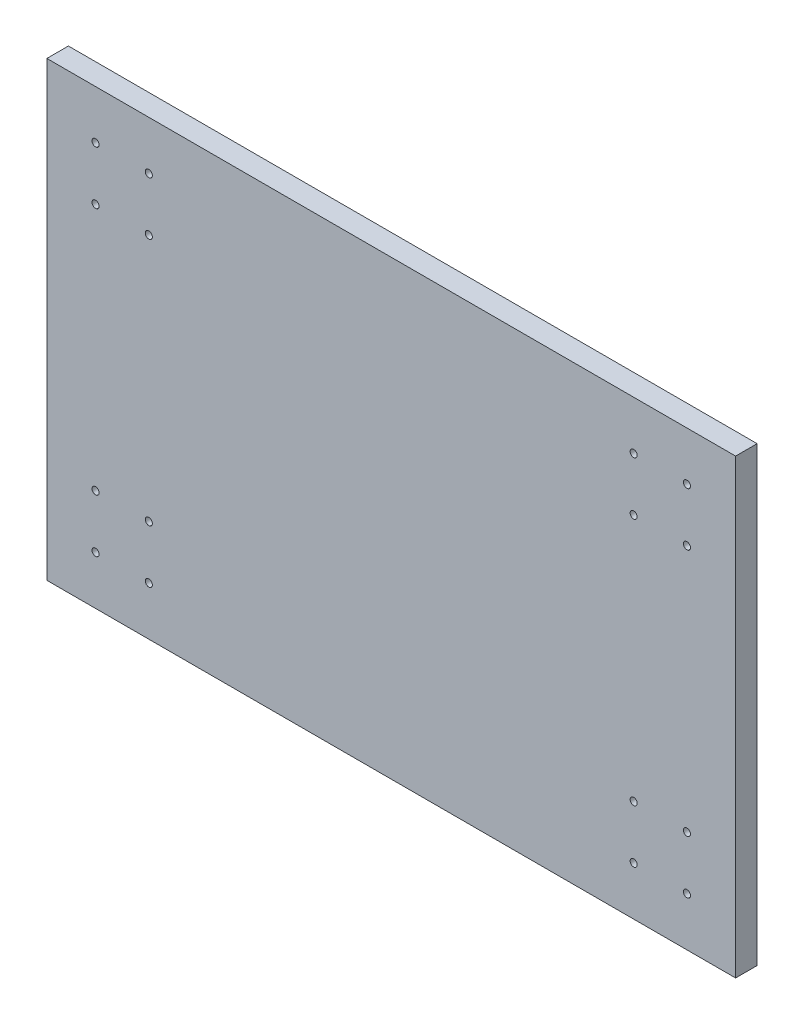
ISO-10303-21;
HEADER;
FILE_DESCRIPTION(('STEP AP214'),'2;1');
FILE_NAME('part.step','',(''),(''),'','','');
FILE_SCHEMA(('AUTOMOTIVE_DESIGN { 1 0 10303 214 1 1 1 1 }'));
ENDSEC;
DATA;
#1=APPLICATION_CONTEXT('core data for automotive mechanical design processes');
#2=APPLICATION_PROTOCOL_DEFINITION('international standard','automotive_design',2000,#1);
#3=PRODUCT_CONTEXT('',#1,'mechanical');
#4=PRODUCT('Part','Part','',(#3));
#5=PRODUCT_RELATED_PRODUCT_CATEGORY('part','',(#4));
#6=PRODUCT_DEFINITION_FORMATION('','',#4);
#7=PRODUCT_DEFINITION_CONTEXT('part definition',#1,'design');
#8=PRODUCT_DEFINITION('design','',#6,#7);
#9=PRODUCT_DEFINITION_SHAPE('','',#8);
#10=(LENGTH_UNIT() NAMED_UNIT(*) SI_UNIT(.MILLI.,.METRE.));
#11=(NAMED_UNIT(*) PLANE_ANGLE_UNIT() SI_UNIT($,.RADIAN.));
#12=(NAMED_UNIT(*) SI_UNIT($,.STERADIAN.) SOLID_ANGLE_UNIT());
#13=UNCERTAINTY_MEASURE_WITH_UNIT(LENGTH_MEASURE(1.E-05),#10,'distance_accuracy_value','');
#14=(GEOMETRIC_REPRESENTATION_CONTEXT(3) GLOBAL_UNCERTAINTY_ASSIGNED_CONTEXT((#13)) GLOBAL_UNIT_ASSIGNED_CONTEXT((#10,
#11,#12)) REPRESENTATION_CONTEXT('',''));
#15=CARTESIAN_POINT('',(0.,0.,0.));
#16=DIRECTION('',(0.,0.,1.));
#17=DIRECTION('',(1.,0.,0.));
#18=AXIS2_PLACEMENT_3D('',#15,#16,#17);
#19=CARTESIAN_POINT('',(0.,0.,10.));
#20=DIRECTION('',(1.,0.,0.));
#21=DIRECTION('',(0.,0.,-1.));
#22=AXIS2_PLACEMENT_3D('',#19,#20,#21);
#23=PLANE('',#22);
#24=DIRECTION('',(0.,-1.,0.));
#25=VECTOR('',#24,1.);
#26=CARTESIAN_POINT('',(0.,0.,0.));
#27=LINE('',#26,#25);
#28=CARTESIAN_POINT('',(0.,210.,0.));
#29=VERTEX_POINT('',#28);
#30=CARTESIAN_POINT('',(0.,0.,0.));
#31=VERTEX_POINT('',#30);
#32=EDGE_CURVE('E106',#29,#31,#27,.T.);
#33=ORIENTED_EDGE('',*,*,#32,.T.);
#34=DIRECTION('',(0.,0.,-1.));
#35=VECTOR('',#34,1.);
#36=CARTESIAN_POINT('',(0.,0.,10.));
#37=LINE('',#36,#35);
#38=CARTESIAN_POINT('',(0.,0.,10.));
#39=VERTEX_POINT('',#38);
#40=EDGE_CURVE('E11',#39,#31,#37,.T.);
#41=ORIENTED_EDGE('',*,*,#40,.F.);
#42=DIRECTION('',(0.,-1.,0.));
#43=VECTOR('',#42,1.);
#44=CARTESIAN_POINT('',(0.,0.,10.));
#45=LINE('',#44,#43);
#46=CARTESIAN_POINT('',(0.,210.,10.));
#47=VERTEX_POINT('',#46);
#48=EDGE_CURVE('E93',#47,#39,#45,.T.);
#49=ORIENTED_EDGE('',*,*,#48,.F.);
#50=DIRECTION('',(0.,0.,-1.));
#51=VECTOR('',#50,1.);
#52=CARTESIAN_POINT('',(0.,210.,10.));
#53=LINE('',#52,#51);
#54=EDGE_CURVE('E102',#47,#29,#53,.T.);
#55=ORIENTED_EDGE('',*,*,#54,.T.);
#56=EDGE_LOOP('',(#33,#41,#49,#55));
#57=FACE_BOUND('',#56,.T.);
#58=ADVANCED_FACE('F40',(#57),#23,.F.);
#59=CARTESIAN_POINT('',(0.,0.,10.));
#60=DIRECTION('',(0.,1.,0.));
#61=DIRECTION('',(0.,0.,1.));
#62=AXIS2_PLACEMENT_3D('',#59,#60,#61);
#63=PLANE('',#62);
#64=DIRECTION('',(1.,0.,0.));
#65=VECTOR('',#64,1.);
#66=CARTESIAN_POINT('',(0.,0.,0.));
#67=LINE('',#66,#65);
#68=CARTESIAN_POINT('',(320.,0.,0.));
#69=VERTEX_POINT('',#68);
#70=EDGE_CURVE('E97',#31,#69,#67,.T.);
#71=ORIENTED_EDGE('',*,*,#70,.T.);
#72=DIRECTION('',(0.,0.,-1.));
#73=VECTOR('',#72,1.);
#74=CARTESIAN_POINT('',(320.,0.,10.));
#75=LINE('',#74,#73);
#76=CARTESIAN_POINT('',(320.,0.,10.));
#77=VERTEX_POINT('',#76);
#78=EDGE_CURVE('E49',#77,#69,#75,.T.);
#79=ORIENTED_EDGE('',*,*,#78,.F.);
#80=DIRECTION('',(1.,0.,0.));
#81=VECTOR('',#80,1.);
#82=CARTESIAN_POINT('',(0.,0.,10.));
#83=LINE('',#82,#81);
#84=EDGE_CURVE('E88',#39,#77,#83,.T.);
#85=ORIENTED_EDGE('',*,*,#84,.F.);
#86=ORIENTED_EDGE('',*,*,#40,.T.);
#87=EDGE_LOOP('',(#71,#79,#85,#86));
#88=FACE_BOUND('',#87,.T.);
#89=ADVANCED_FACE('F96',(#88),#63,.F.);
#90=CARTESIAN_POINT('',(320.,0.,10.));
#91=DIRECTION('',(-1.,0.,0.));
#92=DIRECTION('',(0.,0.,1.));
#93=AXIS2_PLACEMENT_3D('',#90,#91,#92);
#94=PLANE('',#93);
#95=DIRECTION('',(0.,1.,0.));
#96=VECTOR('',#95,1.);
#97=CARTESIAN_POINT('',(320.,0.,0.));
#98=LINE('',#97,#96);
#99=CARTESIAN_POINT('',(320.,210.,0.));
#100=VERTEX_POINT('',#99);
#101=EDGE_CURVE('E75',#69,#100,#98,.T.);
#102=ORIENTED_EDGE('',*,*,#101,.T.);
#103=DIRECTION('',(0.,0.,-1.));
#104=VECTOR('',#103,1.);
#105=CARTESIAN_POINT('',(320.,210.,10.));
#106=LINE('',#105,#104);
#107=CARTESIAN_POINT('',(320.,210.,10.));
#108=VERTEX_POINT('',#107);
#109=EDGE_CURVE('E98',#108,#100,#106,.T.);
#110=ORIENTED_EDGE('',*,*,#109,.F.);
#111=DIRECTION('',(0.,1.,0.));
#112=VECTOR('',#111,1.);
#113=CARTESIAN_POINT('',(320.,0.,10.));
#114=LINE('',#113,#112);
#115=EDGE_CURVE('E91',#77,#108,#114,.T.);
#116=ORIENTED_EDGE('',*,*,#115,.F.);
#117=ORIENTED_EDGE('',*,*,#78,.T.);
#118=EDGE_LOOP('',(#102,#110,#116,#117));
#119=FACE_BOUND('',#118,.T.);
#120=ADVANCED_FACE('F100',(#119),#94,.F.);
#121=CARTESIAN_POINT('',(0.,210.,10.));
#122=DIRECTION('',(0.,-1.,0.));
#123=DIRECTION('',(0.,0.,-1.));
#124=AXIS2_PLACEMENT_3D('',#121,#122,#123);
#125=PLANE('',#124);
#126=DIRECTION('',(-1.,0.,0.));
#127=VECTOR('',#126,1.);
#128=CARTESIAN_POINT('',(0.,210.,0.));
#129=LINE('',#128,#127);
#130=EDGE_CURVE('E81',#100,#29,#129,.T.);
#131=ORIENTED_EDGE('',*,*,#130,.T.);
#132=ORIENTED_EDGE('',*,*,#54,.F.);
#133=DIRECTION('',(-1.,0.,0.));
#134=VECTOR('',#133,1.);
#135=CARTESIAN_POINT('',(0.,210.,10.));
#136=LINE('',#135,#134);
#137=EDGE_CURVE('E58',#108,#47,#136,.T.);
#138=ORIENTED_EDGE('',*,*,#137,.F.);
#139=ORIENTED_EDGE('',*,*,#109,.T.);
#140=EDGE_LOOP('',(#131,#132,#138,#139));
#141=FACE_BOUND('',#140,.T.);
#142=ADVANCED_FACE('F271',(#141),#125,.F.);
#143=CARTESIAN_POINT('',(0.,210.,10.));
#144=DIRECTION('',(0.,0.,-1.));
#145=DIRECTION('',(-1.,0.,0.));
#146=AXIS2_PLACEMENT_3D('',#143,#144,#145);
#147=PLANE('',#146);
#148=CARTESIAN_POINT('',(22.6256313292354,22.6256313292354,10.));
#149=DIRECTION('',(0.,0.,-1.));
#150=DIRECTION('',(-1.,0.,0.));
#151=AXIS2_PLACEMENT_3D('',#148,#149,#150);
#152=CIRCLE('',#151,1.65);
#153=CARTESIAN_POINT('',(20.9756313292354,22.6256313292354,10.));
#154=VERTEX_POINT('',#153);
#155=EDGE_CURVE('E43',#154,#154,#152,.T.);
#156=ORIENTED_EDGE('',*,*,#155,.T.);
#157=EDGE_LOOP('',(#156));
#158=FACE_BOUND('',#157,.T.);
#159=CARTESIAN_POINT('',(47.3743686707646,22.6256313292354,10.));
#160=DIRECTION('',(0.,0.,-1.));
#161=DIRECTION('',(-1.,0.,0.));
#162=AXIS2_PLACEMENT_3D('',#159,#160,#161);
#163=CIRCLE('',#162,1.65);
#164=CARTESIAN_POINT('',(45.7243686707646,22.6256313292354,10.));
#165=VERTEX_POINT('',#164);
#166=EDGE_CURVE('E182',#165,#165,#163,.T.);
#167=ORIENTED_EDGE('',*,*,#166,.T.);
#168=EDGE_LOOP('',(#167));
#169=FACE_BOUND('',#168,.T.);
#170=CARTESIAN_POINT('',(47.3743686707646,47.3743686707646,10.));
#171=DIRECTION('',(0.,0.,-1.));
#172=DIRECTION('',(-1.,0.,0.));
#173=AXIS2_PLACEMENT_3D('',#170,#171,#172);
#174=CIRCLE('',#173,1.65);
#175=CARTESIAN_POINT('',(45.7243686707646,47.3743686707646,10.));
#176=VERTEX_POINT('',#175);
#177=EDGE_CURVE('E178',#176,#176,#174,.T.);
#178=ORIENTED_EDGE('',*,*,#177,.T.);
#179=EDGE_LOOP('',(#178));
#180=FACE_BOUND('',#179,.T.);
#181=CARTESIAN_POINT('',(22.6256313292354,47.3743686707646,10.));
#182=DIRECTION('',(0.,0.,-1.));
#183=DIRECTION('',(-1.,0.,0.));
#184=AXIS2_PLACEMENT_3D('',#181,#182,#183);
#185=CIRCLE('',#184,1.65);
#186=CARTESIAN_POINT('',(20.9756313292354,47.3743686707646,10.));
#187=VERTEX_POINT('',#186);
#188=EDGE_CURVE('E173',#187,#187,#185,.T.);
#189=ORIENTED_EDGE('',*,*,#188,.T.);
#190=EDGE_LOOP('',(#189));
#191=FACE_BOUND('',#190,.T.);
#192=CARTESIAN_POINT('',(297.374368670765,47.3743686707646,10.));
#193=DIRECTION('',(0.,0.,-1.));
#194=DIRECTION('',(-1.,0.,0.));
#195=AXIS2_PLACEMENT_3D('',#192,#193,#194);
#196=CIRCLE('',#195,1.64999999999998);
#197=CARTESIAN_POINT('',(295.724368670765,47.3743686707646,10.));
#198=VERTEX_POINT('',#197);
#199=EDGE_CURVE('E168',#198,#198,#196,.T.);
#200=ORIENTED_EDGE('',*,*,#199,.T.);
#201=EDGE_LOOP('',(#200));
#202=FACE_BOUND('',#201,.T.);
#203=CARTESIAN_POINT('',(272.625631329235,47.3743686707646,10.));
#204=DIRECTION('',(0.,0.,-1.));
#205=DIRECTION('',(-1.,0.,0.));
#206=AXIS2_PLACEMENT_3D('',#203,#204,#205);
#207=CIRCLE('',#206,1.64999999999998);
#208=CARTESIAN_POINT('',(270.975631329235,47.3743686707646,10.));
#209=VERTEX_POINT('',#208);
#210=EDGE_CURVE('E163',#209,#209,#207,.T.);
#211=ORIENTED_EDGE('',*,*,#210,.T.);
#212=EDGE_LOOP('',(#211));
#213=FACE_BOUND('',#212,.T.);
#214=CARTESIAN_POINT('',(272.625631329235,22.6256313292354,10.));
#215=DIRECTION('',(0.,0.,-1.));
#216=DIRECTION('',(-1.,0.,0.));
#217=AXIS2_PLACEMENT_3D('',#214,#215,#216);
#218=CIRCLE('',#217,1.64999999999998);
#219=CARTESIAN_POINT('',(270.975631329235,22.6256313292354,10.));
#220=VERTEX_POINT('',#219);
#221=EDGE_CURVE('E158',#220,#220,#218,.T.);
#222=ORIENTED_EDGE('',*,*,#221,.T.);
#223=EDGE_LOOP('',(#222));
#224=FACE_BOUND('',#223,.T.);
#225=CARTESIAN_POINT('',(297.374368670765,22.6256313292354,10.));
#226=DIRECTION('',(0.,0.,-1.));
#227=DIRECTION('',(-1.,0.,0.));
#228=AXIS2_PLACEMENT_3D('',#225,#226,#227);
#229=CIRCLE('',#228,1.64999999999998);
#230=CARTESIAN_POINT('',(295.724368670765,22.6256313292354,10.));
#231=VERTEX_POINT('',#230);
#232=EDGE_CURVE('E153',#231,#231,#229,.T.);
#233=ORIENTED_EDGE('',*,*,#232,.T.);
#234=EDGE_LOOP('',(#233));
#235=FACE_BOUND('',#234,.T.);
#236=CARTESIAN_POINT('',(22.6256313292355,162.625631329235,10.));
#237=DIRECTION('',(0.,0.,-1.));
#238=DIRECTION('',(-1.,0.,0.));
#239=AXIS2_PLACEMENT_3D('',#236,#237,#238);
#240=CIRCLE('',#239,1.65);
#241=CARTESIAN_POINT('',(20.9756313292355,162.625631329235,10.));
#242=VERTEX_POINT('',#241);
#243=EDGE_CURVE('E148',#242,#242,#240,.T.);
#244=ORIENTED_EDGE('',*,*,#243,.T.);
#245=EDGE_LOOP('',(#244));
#246=FACE_BOUND('',#245,.T.);
#247=CARTESIAN_POINT('',(47.3743686707646,162.625631329235,10.));
#248=DIRECTION('',(0.,0.,-1.));
#249=DIRECTION('',(-1.,0.,0.));
#250=AXIS2_PLACEMENT_3D('',#247,#248,#249);
#251=CIRCLE('',#250,1.65);
#252=CARTESIAN_POINT('',(45.7243686707646,162.625631329235,10.));
#253=VERTEX_POINT('',#252);
#254=EDGE_CURVE('E143',#253,#253,#251,.T.);
#255=ORIENTED_EDGE('',*,*,#254,.T.);
#256=EDGE_LOOP('',(#255));
#257=FACE_BOUND('',#256,.T.);
#258=CARTESIAN_POINT('',(47.3743686707647,187.374368670765,10.));
#259=DIRECTION('',(0.,0.,-1.));
#260=DIRECTION('',(-1.,0.,0.));
#261=AXIS2_PLACEMENT_3D('',#258,#259,#260);
#262=CIRCLE('',#261,1.65);
#263=CARTESIAN_POINT('',(45.7243686707647,187.374368670765,10.));
#264=VERTEX_POINT('',#263);
#265=EDGE_CURVE('E138',#264,#264,#262,.T.);
#266=ORIENTED_EDGE('',*,*,#265,.T.);
#267=EDGE_LOOP('',(#266));
#268=FACE_BOUND('',#267,.T.);
#269=CARTESIAN_POINT('',(22.6256313292355,187.374368670765,10.));
#270=DIRECTION('',(0.,0.,-1.));
#271=DIRECTION('',(-1.,0.,0.));
#272=AXIS2_PLACEMENT_3D('',#269,#270,#271);
#273=CIRCLE('',#272,1.65);
#274=CARTESIAN_POINT('',(20.9756313292355,187.374368670765,10.));
#275=VERTEX_POINT('',#274);
#276=EDGE_CURVE('E133',#275,#275,#273,.T.);
#277=ORIENTED_EDGE('',*,*,#276,.T.);
#278=EDGE_LOOP('',(#277));
#279=FACE_BOUND('',#278,.T.);
#280=CARTESIAN_POINT('',(297.374368670765,187.374368670765,10.));
#281=DIRECTION('',(0.,0.,-1.));
#282=DIRECTION('',(-1.,0.,0.));
#283=AXIS2_PLACEMENT_3D('',#280,#281,#282);
#284=CIRCLE('',#283,1.64999999999998);
#285=CARTESIAN_POINT('',(295.724368670765,187.374368670765,10.));
#286=VERTEX_POINT('',#285);
#287=EDGE_CURVE('E128',#286,#286,#284,.T.);
#288=ORIENTED_EDGE('',*,*,#287,.T.);
#289=EDGE_LOOP('',(#288));
#290=FACE_BOUND('',#289,.T.);
#291=CARTESIAN_POINT('',(272.625631329235,187.374368670765,10.));
#292=DIRECTION('',(0.,0.,-1.));
#293=DIRECTION('',(-1.,0.,0.));
#294=AXIS2_PLACEMENT_3D('',#291,#292,#293);
#295=CIRCLE('',#294,1.64999999999998);
#296=CARTESIAN_POINT('',(270.975631329235,187.374368670765,10.));
#297=VERTEX_POINT('',#296);
#298=EDGE_CURVE('E123',#297,#297,#295,.T.);
#299=ORIENTED_EDGE('',*,*,#298,.T.);
#300=EDGE_LOOP('',(#299));
#301=FACE_BOUND('',#300,.T.);
#302=CARTESIAN_POINT('',(272.625631329235,162.625631329235,10.));
#303=DIRECTION('',(0.,0.,-1.));
#304=DIRECTION('',(-1.,0.,0.));
#305=AXIS2_PLACEMENT_3D('',#302,#303,#304);
#306=CIRCLE('',#305,1.64999999999998);
#307=CARTESIAN_POINT('',(270.975631329235,162.625631329235,10.));
#308=VERTEX_POINT('',#307);
#309=EDGE_CURVE('E118',#308,#308,#306,.T.);
#310=ORIENTED_EDGE('',*,*,#309,.T.);
#311=EDGE_LOOP('',(#310));
#312=FACE_BOUND('',#311,.T.);
#313=CARTESIAN_POINT('',(297.374368670765,162.625631329235,10.));
#314=DIRECTION('',(0.,0.,-1.));
#315=DIRECTION('',(-1.,0.,0.));
#316=AXIS2_PLACEMENT_3D('',#313,#314,#315);
#317=CIRCLE('',#316,1.64999999999998);
#318=CARTESIAN_POINT('',(295.724368670765,162.625631329235,10.));
#319=VERTEX_POINT('',#318);
#320=EDGE_CURVE('E109',#319,#319,#317,.T.);
#321=ORIENTED_EDGE('',*,*,#320,.T.);
#322=EDGE_LOOP('',(#321));
#323=FACE_BOUND('',#322,.T.);
#324=ORIENTED_EDGE('',*,*,#48,.T.);
#325=ORIENTED_EDGE('',*,*,#84,.T.);
#326=ORIENTED_EDGE('',*,*,#115,.T.);
#327=ORIENTED_EDGE('',*,*,#137,.T.);
#328=EDGE_LOOP('',(#324,#325,#326,#327));
#329=FACE_BOUND('',#328,.T.);
#330=ADVANCED_FACE('F89',(#158,#169,#180,#191,#202,#213,#224,#235,#246,#257,#268,#279,#290,#301,
#312,#323,#329),#147,.F.);
#331=CARTESIAN_POINT('',(0.,210.,0.));
#332=DIRECTION('',(0.,0.,-1.));
#333=DIRECTION('',(-1.,0.,0.));
#334=AXIS2_PLACEMENT_3D('',#331,#332,#333);
#335=PLANE('',#334);
#336=CARTESIAN_POINT('',(22.6256313292354,22.6256313292354,0.));
#337=DIRECTION('',(0.,0.,-1.));
#338=DIRECTION('',(-1.,0.,0.));
#339=AXIS2_PLACEMENT_3D('',#336,#337,#338);
#340=CIRCLE('',#339,2.025);
#341=CARTESIAN_POINT('',(20.6006313292354,22.6256313292354,0.));
#342=VERTEX_POINT('',#341);
#343=EDGE_CURVE('E693',#342,#342,#340,.T.);
#344=ORIENTED_EDGE('',*,*,#343,.F.);
#345=EDGE_LOOP('',(#344));
#346=FACE_BOUND('',#345,.T.);
#347=CARTESIAN_POINT('',(47.3743686707646,22.6256313292354,0.));
#348=DIRECTION('',(0.,0.,-1.));
#349=DIRECTION('',(-1.,0.,0.));
#350=AXIS2_PLACEMENT_3D('',#347,#348,#349);
#351=CIRCLE('',#350,2.025);
#352=CARTESIAN_POINT('',(45.3493686707646,22.6256313292354,0.));
#353=VERTEX_POINT('',#352);
#354=EDGE_CURVE('E191',#353,#353,#351,.T.);
#355=ORIENTED_EDGE('',*,*,#354,.F.);
#356=EDGE_LOOP('',(#355));
#357=FACE_BOUND('',#356,.T.);
#358=CARTESIAN_POINT('',(47.3743686707646,47.3743686707646,0.));
#359=DIRECTION('',(0.,0.,-1.));
#360=DIRECTION('',(-1.,0.,0.));
#361=AXIS2_PLACEMENT_3D('',#358,#359,#360);
#362=CIRCLE('',#361,2.025);
#363=CARTESIAN_POINT('',(45.3493686707646,47.3743686707646,0.));
#364=VERTEX_POINT('',#363);
#365=EDGE_CURVE('E184',#364,#364,#362,.T.);
#366=ORIENTED_EDGE('',*,*,#365,.F.);
#367=EDGE_LOOP('',(#366));
#368=FACE_BOUND('',#367,.T.);
#369=CARTESIAN_POINT('',(22.6256313292354,47.3743686707646,0.));
#370=DIRECTION('',(0.,0.,-1.));
#371=DIRECTION('',(-1.,0.,0.));
#372=AXIS2_PLACEMENT_3D('',#369,#370,#371);
#373=CIRCLE('',#372,2.025);
#374=CARTESIAN_POINT('',(20.6006313292354,47.3743686707646,0.));
#375=VERTEX_POINT('',#374);
#376=EDGE_CURVE('E180',#375,#375,#373,.T.);
#377=ORIENTED_EDGE('',*,*,#376,.F.);
#378=EDGE_LOOP('',(#377));
#379=FACE_BOUND('',#378,.T.);
#380=CARTESIAN_POINT('',(297.374368670765,47.3743686707646,0.));
#381=DIRECTION('',(0.,0.,-1.));
#382=DIRECTION('',(-1.,0.,0.));
#383=AXIS2_PLACEMENT_3D('',#380,#381,#382);
#384=CIRCLE('',#383,2.025);
#385=CARTESIAN_POINT('',(295.349368670764,47.3743686707646,0.));
#386=VERTEX_POINT('',#385);
#387=EDGE_CURVE('E176',#386,#386,#384,.T.);
#388=ORIENTED_EDGE('',*,*,#387,.F.);
#389=EDGE_LOOP('',(#388));
#390=FACE_BOUND('',#389,.T.);
#391=CARTESIAN_POINT('',(272.625631329235,47.3743686707646,0.));
#392=DIRECTION('',(0.,0.,-1.));
#393=DIRECTION('',(-1.,0.,0.));
#394=AXIS2_PLACEMENT_3D('',#391,#392,#393);
#395=CIRCLE('',#394,2.025);
#396=CARTESIAN_POINT('',(270.600631329235,47.3743686707646,0.));
#397=VERTEX_POINT('',#396);
#398=EDGE_CURVE('E171',#397,#397,#395,.T.);
#399=ORIENTED_EDGE('',*,*,#398,.F.);
#400=EDGE_LOOP('',(#399));
#401=FACE_BOUND('',#400,.T.);
#402=CARTESIAN_POINT('',(272.625631329235,22.6256313292354,0.));
#403=DIRECTION('',(0.,0.,-1.));
#404=DIRECTION('',(-1.,0.,0.));
#405=AXIS2_PLACEMENT_3D('',#402,#403,#404);
#406=CIRCLE('',#405,2.025);
#407=CARTESIAN_POINT('',(270.600631329235,22.6256313292354,0.));
#408=VERTEX_POINT('',#407);
#409=EDGE_CURVE('E166',#408,#408,#406,.T.);
#410=ORIENTED_EDGE('',*,*,#409,.F.);
#411=EDGE_LOOP('',(#410));
#412=FACE_BOUND('',#411,.T.);
#413=CARTESIAN_POINT('',(297.374368670765,22.6256313292354,0.));
#414=DIRECTION('',(0.,0.,-1.));
#415=DIRECTION('',(-1.,0.,0.));
#416=AXIS2_PLACEMENT_3D('',#413,#414,#415);
#417=CIRCLE('',#416,2.025);
#418=CARTESIAN_POINT('',(295.349368670764,22.6256313292354,0.));
#419=VERTEX_POINT('',#418);
#420=EDGE_CURVE('E161',#419,#419,#417,.T.);
#421=ORIENTED_EDGE('',*,*,#420,.F.);
#422=EDGE_LOOP('',(#421));
#423=FACE_BOUND('',#422,.T.);
#424=CARTESIAN_POINT('',(22.6256313292355,162.625631329235,0.));
#425=DIRECTION('',(0.,0.,-1.));
#426=DIRECTION('',(-1.,0.,0.));
#427=AXIS2_PLACEMENT_3D('',#424,#425,#426);
#428=CIRCLE('',#427,2.025);
#429=CARTESIAN_POINT('',(20.6006313292355,162.625631329235,0.));
#430=VERTEX_POINT('',#429);
#431=EDGE_CURVE('E156',#430,#430,#428,.T.);
#432=ORIENTED_EDGE('',*,*,#431,.F.);
#433=EDGE_LOOP('',(#432));
#434=FACE_BOUND('',#433,.T.);
#435=CARTESIAN_POINT('',(47.3743686707646,162.625631329235,0.));
#436=DIRECTION('',(0.,0.,-1.));
#437=DIRECTION('',(-1.,0.,0.));
#438=AXIS2_PLACEMENT_3D('',#435,#436,#437);
#439=CIRCLE('',#438,2.025);
#440=CARTESIAN_POINT('',(45.3493686707646,162.625631329235,0.));
#441=VERTEX_POINT('',#440);
#442=EDGE_CURVE('E151',#441,#441,#439,.T.);
#443=ORIENTED_EDGE('',*,*,#442,.F.);
#444=EDGE_LOOP('',(#443));
#445=FACE_BOUND('',#444,.T.);
#446=CARTESIAN_POINT('',(47.3743686707647,187.374368670765,0.));
#447=DIRECTION('',(0.,0.,-1.));
#448=DIRECTION('',(-1.,0.,0.));
#449=AXIS2_PLACEMENT_3D('',#446,#447,#448);
#450=CIRCLE('',#449,2.025);
#451=CARTESIAN_POINT('',(45.3493686707647,187.374368670765,0.));
#452=VERTEX_POINT('',#451);
#453=EDGE_CURVE('E146',#452,#452,#450,.T.);
#454=ORIENTED_EDGE('',*,*,#453,.F.);
#455=EDGE_LOOP('',(#454));
#456=FACE_BOUND('',#455,.T.);
#457=CARTESIAN_POINT('',(22.6256313292355,187.374368670765,0.));
#458=DIRECTION('',(0.,0.,-1.));
#459=DIRECTION('',(-1.,0.,0.));
#460=AXIS2_PLACEMENT_3D('',#457,#458,#459);
#461=CIRCLE('',#460,2.025);
#462=CARTESIAN_POINT('',(20.6006313292355,187.374368670765,0.));
#463=VERTEX_POINT('',#462);
#464=EDGE_CURVE('E141',#463,#463,#461,.T.);
#465=ORIENTED_EDGE('',*,*,#464,.F.);
#466=EDGE_LOOP('',(#465));
#467=FACE_BOUND('',#466,.T.);
#468=CARTESIAN_POINT('',(297.374368670765,187.374368670765,0.));
#469=DIRECTION('',(0.,0.,-1.));
#470=DIRECTION('',(-1.,0.,0.));
#471=AXIS2_PLACEMENT_3D('',#468,#469,#470);
#472=CIRCLE('',#471,2.025);
#473=CARTESIAN_POINT('',(295.349368670764,187.374368670765,0.));
#474=VERTEX_POINT('',#473);
#475=EDGE_CURVE('E136',#474,#474,#472,.T.);
#476=ORIENTED_EDGE('',*,*,#475,.F.);
#477=EDGE_LOOP('',(#476));
#478=FACE_BOUND('',#477,.T.);
#479=CARTESIAN_POINT('',(272.625631329235,187.374368670765,0.));
#480=DIRECTION('',(0.,0.,-1.));
#481=DIRECTION('',(-1.,0.,0.));
#482=AXIS2_PLACEMENT_3D('',#479,#480,#481);
#483=CIRCLE('',#482,2.025);
#484=CARTESIAN_POINT('',(270.600631329235,187.374368670765,0.));
#485=VERTEX_POINT('',#484);
#486=EDGE_CURVE('E131',#485,#485,#483,.T.);
#487=ORIENTED_EDGE('',*,*,#486,.F.);
#488=EDGE_LOOP('',(#487));
#489=FACE_BOUND('',#488,.T.);
#490=CARTESIAN_POINT('',(272.625631329235,162.625631329235,0.));
#491=DIRECTION('',(0.,0.,-1.));
#492=DIRECTION('',(-1.,0.,0.));
#493=AXIS2_PLACEMENT_3D('',#490,#491,#492);
#494=CIRCLE('',#493,2.025);
#495=CARTESIAN_POINT('',(270.600631329235,162.625631329235,0.));
#496=VERTEX_POINT('',#495);
#497=EDGE_CURVE('E126',#496,#496,#494,.T.);
#498=ORIENTED_EDGE('',*,*,#497,.F.);
#499=EDGE_LOOP('',(#498));
#500=FACE_BOUND('',#499,.T.);
#501=CARTESIAN_POINT('',(297.374368670765,162.625631329235,0.));
#502=DIRECTION('',(0.,0.,-1.));
#503=DIRECTION('',(-1.,0.,0.));
#504=AXIS2_PLACEMENT_3D('',#501,#502,#503);
#505=CIRCLE('',#504,2.025);
#506=CARTESIAN_POINT('',(295.349368670764,162.625631329235,0.));
#507=VERTEX_POINT('',#506);
#508=EDGE_CURVE('E121',#507,#507,#505,.T.);
#509=ORIENTED_EDGE('',*,*,#508,.F.);
#510=EDGE_LOOP('',(#509));
#511=FACE_BOUND('',#510,.T.);
#512=ORIENTED_EDGE('',*,*,#32,.F.);
#513=ORIENTED_EDGE('',*,*,#130,.F.);
#514=ORIENTED_EDGE('',*,*,#101,.F.);
#515=ORIENTED_EDGE('',*,*,#70,.F.);
#516=EDGE_LOOP('',(#512,#513,#514,#515));
#517=FACE_BOUND('',#516,.T.);
#518=ADVANCED_FACE('F264',(#346,#357,#368,#379,#390,#401,#412,#423,#434,#445,#456,#467,#478,
#489,#500,#511,#517),#335,.T.);
#519=CARTESIAN_POINT('',(297.374368670765,162.625631329235,0.));
#520=DIRECTION('',(0.,0.,-1.));
#521=DIRECTION('',(-1.,0.,0.));
#522=AXIS2_PLACEMENT_3D('',#519,#520,#521);
#523=CYLINDRICAL_SURFACE('',#522,1.64999999999998);
#524=CARTESIAN_POINT('',(297.374368670765,162.625631329235,0.216506350946111));
#525=DIRECTION('',(0.,0.,-1.));
#526=DIRECTION('',(-1.,0.,0.));
#527=AXIS2_PLACEMENT_3D('',#524,#525,#526);
#528=CIRCLE('',#527,1.64999999999998);
#529=CARTESIAN_POINT('',(295.724368670765,162.625631329235,0.216506350946111));
#530=VERTEX_POINT('',#529);
#531=EDGE_CURVE('E117',#530,#530,#528,.T.);
#532=ORIENTED_EDGE('',*,*,#531,.T.);
#533=EDGE_LOOP('',(#532));
#534=FACE_BOUND('',#533,.T.);
#535=ORIENTED_EDGE('',*,*,#320,.F.);
#536=EDGE_LOOP('',(#535));
#537=FACE_BOUND('',#536,.T.);
#538=ADVANCED_FACE('F254',(#534,#537),#523,.F.);
#539=CARTESIAN_POINT('',(297.374368670765,162.625631329235,0.));
#540=DIRECTION('',(0.,0.,-1.));
#541=DIRECTION('',(-1.,0.,0.));
#542=AXIS2_PLACEMENT_3D('',#539,#540,#541);
#543=CONICAL_SURFACE('',#542,2.025,1.04719755119661);
#544=ORIENTED_EDGE('',*,*,#531,.F.);
#545=EDGE_LOOP('',(#544));
#546=FACE_BOUND('',#545,.T.);
#547=ORIENTED_EDGE('',*,*,#508,.T.);
#548=EDGE_LOOP('',(#547));
#549=FACE_BOUND('',#548,.T.);
#550=ADVANCED_FACE('F257',(#546,#549),#543,.F.);
#551=CARTESIAN_POINT('',(272.625631329235,162.625631329235,0.));
#552=DIRECTION('',(0.,0.,-1.));
#553=DIRECTION('',(-1.,0.,0.));
#554=AXIS2_PLACEMENT_3D('',#551,#552,#553);
#555=CYLINDRICAL_SURFACE('',#554,1.64999999999998);
#556=CARTESIAN_POINT('',(272.625631329235,162.625631329235,0.216506350946111));
#557=DIRECTION('',(0.,0.,-1.));
#558=DIRECTION('',(-1.,0.,0.));
#559=AXIS2_PLACEMENT_3D('',#556,#557,#558);
#560=CIRCLE('',#559,1.64999999999998);
#561=CARTESIAN_POINT('',(270.975631329235,162.625631329235,0.216506350946111));
#562=VERTEX_POINT('',#561);
#563=EDGE_CURVE('E122',#562,#562,#560,.T.);
#564=ORIENTED_EDGE('',*,*,#563,.T.);
#565=EDGE_LOOP('',(#564));
#566=FACE_BOUND('',#565,.T.);
#567=ORIENTED_EDGE('',*,*,#309,.F.);
#568=EDGE_LOOP('',(#567));
#569=FACE_BOUND('',#568,.T.);
#570=ADVANCED_FACE('F260',(#566,#569),#555,.F.);
#571=CARTESIAN_POINT('',(272.625631329235,162.625631329235,0.));
#572=DIRECTION('',(0.,0.,-1.));
#573=DIRECTION('',(-1.,0.,0.));
#574=AXIS2_PLACEMENT_3D('',#571,#572,#573);
#575=CONICAL_SURFACE('',#574,2.025,1.04719755119661);
#576=ORIENTED_EDGE('',*,*,#563,.F.);
#577=EDGE_LOOP('',(#576));
#578=FACE_BOUND('',#577,.T.);
#579=ORIENTED_EDGE('',*,*,#497,.T.);
#580=EDGE_LOOP('',(#579));
#581=FACE_BOUND('',#580,.T.);
#582=ADVANCED_FACE('F333',(#578,#581),#575,.F.);
#583=CARTESIAN_POINT('',(272.625631329235,187.374368670765,0.));
#584=DIRECTION('',(0.,0.,-1.));
#585=DIRECTION('',(-1.,0.,0.));
#586=AXIS2_PLACEMENT_3D('',#583,#584,#585);
#587=CYLINDRICAL_SURFACE('',#586,1.64999999999998);
#588=CARTESIAN_POINT('',(272.625631329235,187.374368670765,0.216506350946111));
#589=DIRECTION('',(0.,0.,-1.));
#590=DIRECTION('',(-1.,0.,0.));
#591=AXIS2_PLACEMENT_3D('',#588,#589,#590);
#592=CIRCLE('',#591,1.64999999999998);
#593=CARTESIAN_POINT('',(270.975631329235,187.374368670765,0.216506350946111));
#594=VERTEX_POINT('',#593);
#595=EDGE_CURVE('E127',#594,#594,#592,.T.);
#596=ORIENTED_EDGE('',*,*,#595,.T.);
#597=EDGE_LOOP('',(#596));
#598=FACE_BOUND('',#597,.T.);
#599=ORIENTED_EDGE('',*,*,#298,.F.);
#600=EDGE_LOOP('',(#599));
#601=FACE_BOUND('',#600,.T.);
#602=ADVANCED_FACE('F345',(#598,#601),#587,.F.);
#603=CARTESIAN_POINT('',(272.625631329235,187.374368670765,0.));
#604=DIRECTION('',(0.,0.,-1.));
#605=DIRECTION('',(-1.,0.,0.));
#606=AXIS2_PLACEMENT_3D('',#603,#604,#605);
#607=CONICAL_SURFACE('',#606,2.025,1.04719755119661);
#608=ORIENTED_EDGE('',*,*,#595,.F.);
#609=EDGE_LOOP('',(#608));
#610=FACE_BOUND('',#609,.T.);
#611=ORIENTED_EDGE('',*,*,#486,.T.);
#612=EDGE_LOOP('',(#611));
#613=FACE_BOUND('',#612,.T.);
#614=ADVANCED_FACE('F355',(#610,#613),#607,.F.);
#615=CARTESIAN_POINT('',(297.374368670765,187.374368670765,0.));
#616=DIRECTION('',(0.,0.,-1.));
#617=DIRECTION('',(-1.,0.,0.));
#618=AXIS2_PLACEMENT_3D('',#615,#616,#617);
#619=CYLINDRICAL_SURFACE('',#618,1.64999999999998);
#620=CARTESIAN_POINT('',(297.374368670765,187.374368670765,0.216506350946111));
#621=DIRECTION('',(0.,0.,-1.));
#622=DIRECTION('',(-1.,0.,0.));
#623=AXIS2_PLACEMENT_3D('',#620,#621,#622);
#624=CIRCLE('',#623,1.64999999999998);
#625=CARTESIAN_POINT('',(295.724368670765,187.374368670765,0.216506350946111));
#626=VERTEX_POINT('',#625);
#627=EDGE_CURVE('E132',#626,#626,#624,.T.);
#628=ORIENTED_EDGE('',*,*,#627,.T.);
#629=EDGE_LOOP('',(#628));
#630=FACE_BOUND('',#629,.T.);
#631=ORIENTED_EDGE('',*,*,#287,.F.);
#632=EDGE_LOOP('',(#631));
#633=FACE_BOUND('',#632,.T.);
#634=ADVANCED_FACE('F367',(#630,#633),#619,.F.);
#635=CARTESIAN_POINT('',(297.374368670765,187.374368670765,0.));
#636=DIRECTION('',(0.,0.,-1.));
#637=DIRECTION('',(-1.,0.,0.));
#638=AXIS2_PLACEMENT_3D('',#635,#636,#637);
#639=CONICAL_SURFACE('',#638,2.025,1.04719755119661);
#640=ORIENTED_EDGE('',*,*,#627,.F.);
#641=EDGE_LOOP('',(#640));
#642=FACE_BOUND('',#641,.T.);
#643=ORIENTED_EDGE('',*,*,#475,.T.);
#644=EDGE_LOOP('',(#643));
#645=FACE_BOUND('',#644,.T.);
#646=ADVANCED_FACE('F377',(#642,#645),#639,.F.);
#647=CARTESIAN_POINT('',(22.6256313292355,187.374368670765,0.));
#648=DIRECTION('',(0.,0.,-1.));
#649=DIRECTION('',(-1.,0.,0.));
#650=AXIS2_PLACEMENT_3D('',#647,#648,#649);
#651=CYLINDRICAL_SURFACE('',#650,1.65);
#652=CARTESIAN_POINT('',(22.6256313292355,187.374368670765,0.216506350946111));
#653=DIRECTION('',(0.,0.,-1.));
#654=DIRECTION('',(-1.,0.,0.));
#655=AXIS2_PLACEMENT_3D('',#652,#653,#654);
#656=CIRCLE('',#655,1.65);
#657=CARTESIAN_POINT('',(20.9756313292355,187.374368670765,0.216506350946111));
#658=VERTEX_POINT('',#657);
#659=EDGE_CURVE('E137',#658,#658,#656,.T.);
#660=ORIENTED_EDGE('',*,*,#659,.T.);
#661=EDGE_LOOP('',(#660));
#662=FACE_BOUND('',#661,.T.);
#663=ORIENTED_EDGE('',*,*,#276,.F.);
#664=EDGE_LOOP('',(#663));
#665=FACE_BOUND('',#664,.T.);
#666=ADVANCED_FACE('F389',(#662,#665),#651,.F.);
#667=CARTESIAN_POINT('',(22.6256313292355,187.374368670765,0.));
#668=DIRECTION('',(0.,0.,-1.));
#669=DIRECTION('',(-1.,0.,0.));
#670=AXIS2_PLACEMENT_3D('',#667,#668,#669);
#671=CONICAL_SURFACE('',#670,2.025,1.0471975511966);
#672=ORIENTED_EDGE('',*,*,#659,.F.);
#673=EDGE_LOOP('',(#672));
#674=FACE_BOUND('',#673,.T.);
#675=ORIENTED_EDGE('',*,*,#464,.T.);
#676=EDGE_LOOP('',(#675));
#677=FACE_BOUND('',#676,.T.);
#678=ADVANCED_FACE('F399',(#674,#677),#671,.F.);
#679=CARTESIAN_POINT('',(47.3743686707647,187.374368670765,0.));
#680=DIRECTION('',(0.,0.,-1.));
#681=DIRECTION('',(-1.,0.,0.));
#682=AXIS2_PLACEMENT_3D('',#679,#680,#681);
#683=CYLINDRICAL_SURFACE('',#682,1.65);
#684=CARTESIAN_POINT('',(47.3743686707647,187.374368670765,0.216506350946111));
#685=DIRECTION('',(0.,0.,-1.));
#686=DIRECTION('',(-1.,0.,0.));
#687=AXIS2_PLACEMENT_3D('',#684,#685,#686);
#688=CIRCLE('',#687,1.65);
#689=CARTESIAN_POINT('',(45.7243686707647,187.374368670765,0.216506350946111));
#690=VERTEX_POINT('',#689);
#691=EDGE_CURVE('E142',#690,#690,#688,.T.);
#692=ORIENTED_EDGE('',*,*,#691,.T.);
#693=EDGE_LOOP('',(#692));
#694=FACE_BOUND('',#693,.T.);
#695=ORIENTED_EDGE('',*,*,#265,.F.);
#696=EDGE_LOOP('',(#695));
#697=FACE_BOUND('',#696,.T.);
#698=ADVANCED_FACE('F411',(#694,#697),#683,.F.);
#699=CARTESIAN_POINT('',(47.3743686707647,187.374368670765,0.));
#700=DIRECTION('',(0.,0.,-1.));
#701=DIRECTION('',(-1.,0.,0.));
#702=AXIS2_PLACEMENT_3D('',#699,#700,#701);
#703=CONICAL_SURFACE('',#702,2.025,1.0471975511966);
#704=ORIENTED_EDGE('',*,*,#691,.F.);
#705=EDGE_LOOP('',(#704));
#706=FACE_BOUND('',#705,.T.);
#707=ORIENTED_EDGE('',*,*,#453,.T.);
#708=EDGE_LOOP('',(#707));
#709=FACE_BOUND('',#708,.T.);
#710=ADVANCED_FACE('F421',(#706,#709),#703,.F.);
#711=CARTESIAN_POINT('',(47.3743686707646,162.625631329235,0.));
#712=DIRECTION('',(0.,0.,-1.));
#713=DIRECTION('',(-1.,0.,0.));
#714=AXIS2_PLACEMENT_3D('',#711,#712,#713);
#715=CYLINDRICAL_SURFACE('',#714,1.65);
#716=CARTESIAN_POINT('',(47.3743686707646,162.625631329235,0.216506350946111));
#717=DIRECTION('',(0.,0.,-1.));
#718=DIRECTION('',(-1.,0.,0.));
#719=AXIS2_PLACEMENT_3D('',#716,#717,#718);
#720=CIRCLE('',#719,1.65);
#721=CARTESIAN_POINT('',(45.7243686707646,162.625631329235,0.216506350946111));
#722=VERTEX_POINT('',#721);
#723=EDGE_CURVE('E147',#722,#722,#720,.T.);
#724=ORIENTED_EDGE('',*,*,#723,.T.);
#725=EDGE_LOOP('',(#724));
#726=FACE_BOUND('',#725,.T.);
#727=ORIENTED_EDGE('',*,*,#254,.F.);
#728=EDGE_LOOP('',(#727));
#729=FACE_BOUND('',#728,.T.);
#730=ADVANCED_FACE('F433',(#726,#729),#715,.F.);
#731=CARTESIAN_POINT('',(47.3743686707646,162.625631329235,0.));
#732=DIRECTION('',(0.,0.,-1.));
#733=DIRECTION('',(-1.,0.,0.));
#734=AXIS2_PLACEMENT_3D('',#731,#732,#733);
#735=CONICAL_SURFACE('',#734,2.025,1.0471975511966);
#736=ORIENTED_EDGE('',*,*,#723,.F.);
#737=EDGE_LOOP('',(#736));
#738=FACE_BOUND('',#737,.T.);
#739=ORIENTED_EDGE('',*,*,#442,.T.);
#740=EDGE_LOOP('',(#739));
#741=FACE_BOUND('',#740,.T.);
#742=ADVANCED_FACE('F443',(#738,#741),#735,.F.);
#743=CARTESIAN_POINT('',(22.6256313292355,162.625631329235,0.));
#744=DIRECTION('',(0.,0.,-1.));
#745=DIRECTION('',(-1.,0.,0.));
#746=AXIS2_PLACEMENT_3D('',#743,#744,#745);
#747=CYLINDRICAL_SURFACE('',#746,1.65);
#748=CARTESIAN_POINT('',(22.6256313292355,162.625631329235,0.216506350946111));
#749=DIRECTION('',(0.,0.,-1.));
#750=DIRECTION('',(-1.,0.,0.));
#751=AXIS2_PLACEMENT_3D('',#748,#749,#750);
#752=CIRCLE('',#751,1.65);
#753=CARTESIAN_POINT('',(20.9756313292355,162.625631329235,0.216506350946111));
#754=VERTEX_POINT('',#753);
#755=EDGE_CURVE('E152',#754,#754,#752,.T.);
#756=ORIENTED_EDGE('',*,*,#755,.T.);
#757=EDGE_LOOP('',(#756));
#758=FACE_BOUND('',#757,.T.);
#759=ORIENTED_EDGE('',*,*,#243,.F.);
#760=EDGE_LOOP('',(#759));
#761=FACE_BOUND('',#760,.T.);
#762=ADVANCED_FACE('F455',(#758,#761),#747,.F.);
#763=CARTESIAN_POINT('',(22.6256313292355,162.625631329235,0.));
#764=DIRECTION('',(0.,0.,-1.));
#765=DIRECTION('',(-1.,0.,0.));
#766=AXIS2_PLACEMENT_3D('',#763,#764,#765);
#767=CONICAL_SURFACE('',#766,2.025,1.0471975511966);
#768=ORIENTED_EDGE('',*,*,#755,.F.);
#769=EDGE_LOOP('',(#768));
#770=FACE_BOUND('',#769,.T.);
#771=ORIENTED_EDGE('',*,*,#431,.T.);
#772=EDGE_LOOP('',(#771));
#773=FACE_BOUND('',#772,.T.);
#774=ADVANCED_FACE('F465',(#770,#773),#767,.F.);
#775=CARTESIAN_POINT('',(297.374368670765,22.6256313292354,0.));
#776=DIRECTION('',(0.,0.,-1.));
#777=DIRECTION('',(-1.,0.,0.));
#778=AXIS2_PLACEMENT_3D('',#775,#776,#777);
#779=CYLINDRICAL_SURFACE('',#778,1.64999999999998);
#780=CARTESIAN_POINT('',(297.374368670765,22.6256313292354,0.216506350946111));
#781=DIRECTION('',(0.,0.,-1.));
#782=DIRECTION('',(-1.,0.,0.));
#783=AXIS2_PLACEMENT_3D('',#780,#781,#782);
#784=CIRCLE('',#783,1.64999999999998);
#785=CARTESIAN_POINT('',(295.724368670765,22.6256313292354,0.216506350946111));
#786=VERTEX_POINT('',#785);
#787=EDGE_CURVE('E157',#786,#786,#784,.T.);
#788=ORIENTED_EDGE('',*,*,#787,.T.);
#789=EDGE_LOOP('',(#788));
#790=FACE_BOUND('',#789,.T.);
#791=ORIENTED_EDGE('',*,*,#232,.F.);
#792=EDGE_LOOP('',(#791));
#793=FACE_BOUND('',#792,.T.);
#794=ADVANCED_FACE('F477',(#790,#793),#779,.F.);
#795=CARTESIAN_POINT('',(297.374368670765,22.6256313292354,0.));
#796=DIRECTION('',(0.,0.,-1.));
#797=DIRECTION('',(-1.,0.,0.));
#798=AXIS2_PLACEMENT_3D('',#795,#796,#797);
#799=CONICAL_SURFACE('',#798,2.025,1.04719755119661);
#800=ORIENTED_EDGE('',*,*,#787,.F.);
#801=EDGE_LOOP('',(#800));
#802=FACE_BOUND('',#801,.T.);
#803=ORIENTED_EDGE('',*,*,#420,.T.);
#804=EDGE_LOOP('',(#803));
#805=FACE_BOUND('',#804,.T.);
#806=ADVANCED_FACE('F487',(#802,#805),#799,.F.);
#807=CARTESIAN_POINT('',(272.625631329235,22.6256313292354,0.));
#808=DIRECTION('',(0.,0.,-1.));
#809=DIRECTION('',(-1.,0.,0.));
#810=AXIS2_PLACEMENT_3D('',#807,#808,#809);
#811=CYLINDRICAL_SURFACE('',#810,1.64999999999998);
#812=CARTESIAN_POINT('',(272.625631329235,22.6256313292354,0.216506350946111));
#813=DIRECTION('',(0.,0.,-1.));
#814=DIRECTION('',(-1.,0.,0.));
#815=AXIS2_PLACEMENT_3D('',#812,#813,#814);
#816=CIRCLE('',#815,1.64999999999998);
#817=CARTESIAN_POINT('',(270.975631329235,22.6256313292354,0.216506350946111));
#818=VERTEX_POINT('',#817);
#819=EDGE_CURVE('E162',#818,#818,#816,.T.);
#820=ORIENTED_EDGE('',*,*,#819,.T.);
#821=EDGE_LOOP('',(#820));
#822=FACE_BOUND('',#821,.T.);
#823=ORIENTED_EDGE('',*,*,#221,.F.);
#824=EDGE_LOOP('',(#823));
#825=FACE_BOUND('',#824,.T.);
#826=ADVANCED_FACE('F499',(#822,#825),#811,.F.);
#827=CARTESIAN_POINT('',(272.625631329235,22.6256313292354,0.));
#828=DIRECTION('',(0.,0.,-1.));
#829=DIRECTION('',(-1.,0.,0.));
#830=AXIS2_PLACEMENT_3D('',#827,#828,#829);
#831=CONICAL_SURFACE('',#830,2.025,1.04719755119661);
#832=ORIENTED_EDGE('',*,*,#819,.F.);
#833=EDGE_LOOP('',(#832));
#834=FACE_BOUND('',#833,.T.);
#835=ORIENTED_EDGE('',*,*,#409,.T.);
#836=EDGE_LOOP('',(#835));
#837=FACE_BOUND('',#836,.T.);
#838=ADVANCED_FACE('F509',(#834,#837),#831,.F.);
#839=CARTESIAN_POINT('',(272.625631329235,47.3743686707646,0.));
#840=DIRECTION('',(0.,0.,-1.));
#841=DIRECTION('',(-1.,0.,0.));
#842=AXIS2_PLACEMENT_3D('',#839,#840,#841);
#843=CYLINDRICAL_SURFACE('',#842,1.64999999999998);
#844=CARTESIAN_POINT('',(272.625631329235,47.3743686707646,0.216506350946111));
#845=DIRECTION('',(0.,0.,-1.));
#846=DIRECTION('',(-1.,0.,0.));
#847=AXIS2_PLACEMENT_3D('',#844,#845,#846);
#848=CIRCLE('',#847,1.64999999999998);
#849=CARTESIAN_POINT('',(270.975631329235,47.3743686707646,0.216506350946111));
#850=VERTEX_POINT('',#849);
#851=EDGE_CURVE('E167',#850,#850,#848,.T.);
#852=ORIENTED_EDGE('',*,*,#851,.T.);
#853=EDGE_LOOP('',(#852));
#854=FACE_BOUND('',#853,.T.);
#855=ORIENTED_EDGE('',*,*,#210,.F.);
#856=EDGE_LOOP('',(#855));
#857=FACE_BOUND('',#856,.T.);
#858=ADVANCED_FACE('F521',(#854,#857),#843,.F.);
#859=CARTESIAN_POINT('',(272.625631329235,47.3743686707646,0.));
#860=DIRECTION('',(0.,0.,-1.));
#861=DIRECTION('',(-1.,0.,0.));
#862=AXIS2_PLACEMENT_3D('',#859,#860,#861);
#863=CONICAL_SURFACE('',#862,2.025,1.04719755119661);
#864=ORIENTED_EDGE('',*,*,#851,.F.);
#865=EDGE_LOOP('',(#864));
#866=FACE_BOUND('',#865,.T.);
#867=ORIENTED_EDGE('',*,*,#398,.T.);
#868=EDGE_LOOP('',(#867));
#869=FACE_BOUND('',#868,.T.);
#870=ADVANCED_FACE('F531',(#866,#869),#863,.F.);
#871=CARTESIAN_POINT('',(297.374368670765,47.3743686707646,0.));
#872=DIRECTION('',(0.,0.,-1.));
#873=DIRECTION('',(-1.,0.,0.));
#874=AXIS2_PLACEMENT_3D('',#871,#872,#873);
#875=CYLINDRICAL_SURFACE('',#874,1.64999999999998);
#876=CARTESIAN_POINT('',(297.374368670765,47.3743686707646,0.216506350946111));
#877=DIRECTION('',(0.,0.,-1.));
#878=DIRECTION('',(-1.,0.,0.));
#879=AXIS2_PLACEMENT_3D('',#876,#877,#878);
#880=CIRCLE('',#879,1.64999999999998);
#881=CARTESIAN_POINT('',(295.724368670765,47.3743686707646,0.216506350946111));
#882=VERTEX_POINT('',#881);
#883=EDGE_CURVE('E172',#882,#882,#880,.T.);
#884=ORIENTED_EDGE('',*,*,#883,.T.);
#885=EDGE_LOOP('',(#884));
#886=FACE_BOUND('',#885,.T.);
#887=ORIENTED_EDGE('',*,*,#199,.F.);
#888=EDGE_LOOP('',(#887));
#889=FACE_BOUND('',#888,.T.);
#890=ADVANCED_FACE('F543',(#886,#889),#875,.F.);
#891=CARTESIAN_POINT('',(297.374368670765,47.3743686707646,0.));
#892=DIRECTION('',(0.,0.,-1.));
#893=DIRECTION('',(-1.,0.,0.));
#894=AXIS2_PLACEMENT_3D('',#891,#892,#893);
#895=CONICAL_SURFACE('',#894,2.025,1.04719755119661);
#896=ORIENTED_EDGE('',*,*,#883,.F.);
#897=EDGE_LOOP('',(#896));
#898=FACE_BOUND('',#897,.T.);
#899=ORIENTED_EDGE('',*,*,#387,.T.);
#900=EDGE_LOOP('',(#899));
#901=FACE_BOUND('',#900,.T.);
#902=ADVANCED_FACE('F553',(#898,#901),#895,.F.);
#903=CARTESIAN_POINT('',(22.6256313292354,47.3743686707646,0.));
#904=DIRECTION('',(0.,0.,-1.));
#905=DIRECTION('',(-1.,0.,0.));
#906=AXIS2_PLACEMENT_3D('',#903,#904,#905);
#907=CYLINDRICAL_SURFACE('',#906,1.65);
#908=CARTESIAN_POINT('',(22.6256313292354,47.3743686707646,0.216506350946111));
#909=DIRECTION('',(0.,0.,-1.));
#910=DIRECTION('',(-1.,0.,0.));
#911=AXIS2_PLACEMENT_3D('',#908,#909,#910);
#912=CIRCLE('',#911,1.65);
#913=CARTESIAN_POINT('',(20.9756313292354,47.3743686707646,0.216506350946111));
#914=VERTEX_POINT('',#913);
#915=EDGE_CURVE('E177',#914,#914,#912,.T.);
#916=ORIENTED_EDGE('',*,*,#915,.T.);
#917=EDGE_LOOP('',(#916));
#918=FACE_BOUND('',#917,.T.);
#919=ORIENTED_EDGE('',*,*,#188,.F.);
#920=EDGE_LOOP('',(#919));
#921=FACE_BOUND('',#920,.T.);
#922=ADVANCED_FACE('F565',(#918,#921),#907,.F.);
#923=CARTESIAN_POINT('',(22.6256313292354,47.3743686707646,0.));
#924=DIRECTION('',(0.,0.,-1.));
#925=DIRECTION('',(-1.,0.,0.));
#926=AXIS2_PLACEMENT_3D('',#923,#924,#925);
#927=CONICAL_SURFACE('',#926,2.025,1.0471975511966);
#928=ORIENTED_EDGE('',*,*,#915,.F.);
#929=EDGE_LOOP('',(#928));
#930=FACE_BOUND('',#929,.T.);
#931=ORIENTED_EDGE('',*,*,#376,.T.);
#932=EDGE_LOOP('',(#931));
#933=FACE_BOUND('',#932,.T.);
#934=ADVANCED_FACE('F575',(#930,#933),#927,.F.);
#935=CARTESIAN_POINT('',(47.3743686707646,47.3743686707646,0.));
#936=DIRECTION('',(0.,0.,-1.));
#937=DIRECTION('',(-1.,0.,0.));
#938=AXIS2_PLACEMENT_3D('',#935,#936,#937);
#939=CYLINDRICAL_SURFACE('',#938,1.65);
#940=CARTESIAN_POINT('',(47.3743686707646,47.3743686707646,0.216506350946111));
#941=DIRECTION('',(0.,0.,-1.));
#942=DIRECTION('',(-1.,0.,0.));
#943=AXIS2_PLACEMENT_3D('',#940,#941,#942);
#944=CIRCLE('',#943,1.65);
#945=CARTESIAN_POINT('',(45.7243686707646,47.3743686707646,0.216506350946111));
#946=VERTEX_POINT('',#945);
#947=EDGE_CURVE('E181',#946,#946,#944,.T.);
#948=ORIENTED_EDGE('',*,*,#947,.T.);
#949=EDGE_LOOP('',(#948));
#950=FACE_BOUND('',#949,.T.);
#951=ORIENTED_EDGE('',*,*,#177,.F.);
#952=EDGE_LOOP('',(#951));
#953=FACE_BOUND('',#952,.T.);
#954=ADVANCED_FACE('F587',(#950,#953),#939,.F.);
#955=CARTESIAN_POINT('',(47.3743686707646,47.3743686707646,0.));
#956=DIRECTION('',(0.,0.,-1.));
#957=DIRECTION('',(-1.,0.,0.));
#958=AXIS2_PLACEMENT_3D('',#955,#956,#957);
#959=CONICAL_SURFACE('',#958,2.025,1.0471975511966);
#960=ORIENTED_EDGE('',*,*,#947,.F.);
#961=EDGE_LOOP('',(#960));
#962=FACE_BOUND('',#961,.T.);
#963=ORIENTED_EDGE('',*,*,#365,.T.);
#964=EDGE_LOOP('',(#963));
#965=FACE_BOUND('',#964,.T.);
#966=ADVANCED_FACE('F597',(#962,#965),#959,.F.);
#967=CARTESIAN_POINT('',(47.3743686707646,22.6256313292354,0.));
#968=DIRECTION('',(0.,0.,-1.));
#969=DIRECTION('',(-1.,0.,0.));
#970=AXIS2_PLACEMENT_3D('',#967,#968,#969);
#971=CYLINDRICAL_SURFACE('',#970,1.65);
#972=CARTESIAN_POINT('',(47.3743686707646,22.6256313292354,0.216506350946111));
#973=DIRECTION('',(0.,0.,-1.));
#974=DIRECTION('',(-1.,0.,0.));
#975=AXIS2_PLACEMENT_3D('',#972,#973,#974);
#976=CIRCLE('',#975,1.65);
#977=CARTESIAN_POINT('',(45.7243686707646,22.6256313292354,0.216506350946111));
#978=VERTEX_POINT('',#977);
#979=EDGE_CURVE('E185',#978,#978,#976,.T.);
#980=ORIENTED_EDGE('',*,*,#979,.T.);
#981=EDGE_LOOP('',(#980));
#982=FACE_BOUND('',#981,.T.);
#983=ORIENTED_EDGE('',*,*,#166,.F.);
#984=EDGE_LOOP('',(#983));
#985=FACE_BOUND('',#984,.T.);
#986=ADVANCED_FACE('F609',(#982,#985),#971,.F.);
#987=CARTESIAN_POINT('',(47.3743686707646,22.6256313292354,0.));
#988=DIRECTION('',(0.,0.,-1.));
#989=DIRECTION('',(-1.,0.,0.));
#990=AXIS2_PLACEMENT_3D('',#987,#988,#989);
#991=CONICAL_SURFACE('',#990,2.025,1.0471975511966);
#992=ORIENTED_EDGE('',*,*,#979,.F.);
#993=EDGE_LOOP('',(#992));
#994=FACE_BOUND('',#993,.T.);
#995=ORIENTED_EDGE('',*,*,#354,.T.);
#996=EDGE_LOOP('',(#995));
#997=FACE_BOUND('',#996,.T.);
#998=ADVANCED_FACE('F619',(#994,#997),#991,.F.);
#999=CARTESIAN_POINT('',(22.6256313292354,22.6256313292354,0.));
#1000=DIRECTION('',(0.,0.,-1.));
#1001=DIRECTION('',(-1.,0.,0.));
#1002=AXIS2_PLACEMENT_3D('',#999,#1000,#1001);
#1003=CYLINDRICAL_SURFACE('',#1002,1.65);
#1004=CARTESIAN_POINT('',(22.6256313292354,22.6256313292354,0.216506350946111));
#1005=DIRECTION('',(0.,0.,-1.));
#1006=DIRECTION('',(-1.,0.,0.));
#1007=AXIS2_PLACEMENT_3D('',#1004,#1005,#1006);
#1008=CIRCLE('',#1007,1.65);
#1009=CARTESIAN_POINT('',(20.9756313292354,22.6256313292354,0.216506350946111));
#1010=VERTEX_POINT('',#1009);
#1011=EDGE_CURVE('E690',#1010,#1010,#1008,.T.);
#1012=ORIENTED_EDGE('',*,*,#1011,.T.);
#1013=EDGE_LOOP('',(#1012));
#1014=FACE_BOUND('',#1013,.T.);
#1015=ORIENTED_EDGE('',*,*,#155,.F.);
#1016=EDGE_LOOP('',(#1015));
#1017=FACE_BOUND('',#1016,.T.);
#1018=ADVANCED_FACE('F630',(#1014,#1017),#1003,.F.);
#1019=CARTESIAN_POINT('',(22.6256313292354,22.6256313292354,0.));
#1020=DIRECTION('',(0.,0.,-1.));
#1021=DIRECTION('',(-1.,0.,0.));
#1022=AXIS2_PLACEMENT_3D('',#1019,#1020,#1021);
#1023=CONICAL_SURFACE('',#1022,2.025,1.0471975511966);
#1024=ORIENTED_EDGE('',*,*,#1011,.F.);
#1025=EDGE_LOOP('',(#1024));
#1026=FACE_BOUND('',#1025,.T.);
#1027=ORIENTED_EDGE('',*,*,#343,.T.);
#1028=EDGE_LOOP('',(#1027));
#1029=FACE_BOUND('',#1028,.T.);
#1030=ADVANCED_FACE('F640',(#1026,#1029),#1023,.F.);
#1031=CLOSED_SHELL('',(#58,#89,#120,#142,#330,#518,#538,#550,#570,#582,#602,#614,#634,#646,#666,
#678,#698,#710,#730,#742,#762,#774,#794,#806,#826,#838,#858,#870,#890,#902,#922,#934,#954,#966,
#986,#998,#1018,#1030));
#1032=MANIFOLD_SOLID_BREP('B2',#1031);
#1033=ADVANCED_BREP_SHAPE_REPRESENTATION('',(#18,#1032),#14);
#1034=SHAPE_DEFINITION_REPRESENTATION(#9,#1033);
ENDSEC;
END-ISO-10303-21;
